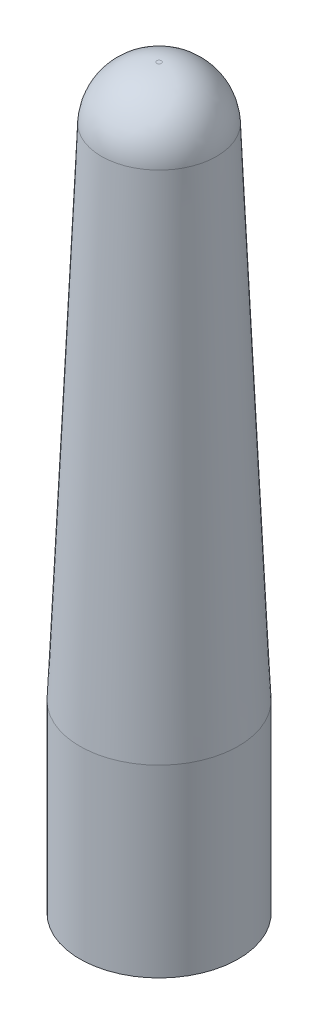
ISO-10303-21;
HEADER;
FILE_DESCRIPTION(('STEP AP214'),'2;1');
FILE_NAME('part.step','',(''),(''),'','','');
FILE_SCHEMA(('AUTOMOTIVE_DESIGN { 1 0 10303 214 1 1 1 1 }'));
ENDSEC;
DATA;
#1=APPLICATION_CONTEXT('core data for automotive mechanical design processes');
#2=APPLICATION_PROTOCOL_DEFINITION('international standard','automotive_design',2000,#1);
#3=PRODUCT_CONTEXT('',#1,'mechanical');
#4=PRODUCT('Part','Part','',(#3));
#5=PRODUCT_RELATED_PRODUCT_CATEGORY('part','',(#4));
#6=PRODUCT_DEFINITION_FORMATION('','',#4);
#7=PRODUCT_DEFINITION_CONTEXT('part definition',#1,'design');
#8=PRODUCT_DEFINITION('design','',#6,#7);
#9=PRODUCT_DEFINITION_SHAPE('','',#8);
#10=(LENGTH_UNIT() NAMED_UNIT(*) SI_UNIT(.MILLI.,.METRE.));
#11=(NAMED_UNIT(*) PLANE_ANGLE_UNIT() SI_UNIT($,.RADIAN.));
#12=(NAMED_UNIT(*) SI_UNIT($,.STERADIAN.) SOLID_ANGLE_UNIT());
#13=UNCERTAINTY_MEASURE_WITH_UNIT(LENGTH_MEASURE(1.E-05),#10,'distance_accuracy_value','');
#14=(GEOMETRIC_REPRESENTATION_CONTEXT(3) GLOBAL_UNCERTAINTY_ASSIGNED_CONTEXT((#13)) GLOBAL_UNIT_ASSIGNED_CONTEXT((#10,
#11,#12)) REPRESENTATION_CONTEXT('',''));
#15=CARTESIAN_POINT('',(0.,0.,0.));
#16=DIRECTION('',(0.,0.,1.));
#17=DIRECTION('',(1.,0.,0.));
#18=AXIS2_PLACEMENT_3D('',#15,#16,#17);
#19=CARTESIAN_POINT('',(0.,38.1,0.));
#20=DIRECTION('',(0.,1.,0.));
#21=DIRECTION('',(0.,0.,1.));
#22=AXIS2_PLACEMENT_3D('',#19,#20,#21);
#23=PLANE('',#22);
#24=CARTESIAN_POINT('',(0.,38.1,0.));
#25=DIRECTION('',(0.,1.,0.));
#26=DIRECTION('',(0.,0.,1.));
#27=AXIS2_PLACEMENT_3D('',#24,#25,#26);
#28=CIRCLE('',#27,0.161524511039541);
#29=CARTESIAN_POINT('',(0.,38.1,0.161524511039541));
#30=VERTEX_POINT('',#29);
#31=EDGE_CURVE('E10',#30,#30,#28,.T.);
#32=ORIENTED_EDGE('',*,*,#31,.T.);
#33=EDGE_LOOP('',(#32));
#34=FACE_BOUND('',#33,.T.);
#35=ADVANCED_FACE('F35',(#34),#23,.T.);
#36=CARTESIAN_POINT('',(0.,0.,0.));
#37=DIRECTION('',(0.,-1.,0.));
#38=DIRECTION('',(0.,0.,-1.));
#39=AXIS2_PLACEMENT_3D('',#36,#37,#38);
#40=CONICAL_SURFACE('',#39,5.461,0.0433062403947096);
#41=CARTESIAN_POINT('',(0.,34.4549452074099,0.));
#42=DIRECTION('',(0.,1.,0.));
#43=DIRECTION('',(0.,0.,1.));
#44=AXIS2_PLACEMENT_3D('',#41,#42,#43);
#45=CIRCLE('',#44,3.96795237434557);
#46=CARTESIAN_POINT('',(0.,34.4549452074099,3.96795237434557));
#47=VERTEX_POINT('',#46);
#48=EDGE_CURVE('E42',#47,#47,#45,.F.);
#49=ORIENTED_EDGE('',*,*,#48,.T.);
#50=EDGE_LOOP('',(#49));
#51=FACE_BOUND('',#50,.T.);
#52=CARTESIAN_POINT('',(0.,0.,0.));
#53=DIRECTION('',(0.,-1.,0.));
#54=DIRECTION('',(0.,0.,-1.));
#55=AXIS2_PLACEMENT_3D('',#52,#53,#54);
#56=CIRCLE('',#55,5.461);
#57=CARTESIAN_POINT('',(0.,0.,-5.461));
#58=VERTEX_POINT('',#57);
#59=EDGE_CURVE('E46',#58,#58,#56,.T.);
#60=ORIENTED_EDGE('',*,*,#59,.F.);
#61=EDGE_LOOP('',(#60));
#62=FACE_BOUND('',#61,.T.);
#63=ADVANCED_FACE('F61',(#51,#62),#40,.T.);
#64=CARTESIAN_POINT('',(0.,-12.7,0.));
#65=DIRECTION('',(0.,1.,0.));
#66=DIRECTION('',(0.,0.,1.));
#67=AXIS2_PLACEMENT_3D('',#64,#65,#66);
#68=CYLINDRICAL_SURFACE('',#67,5.461);
#69=CARTESIAN_POINT('',(0.,-12.7,0.));
#70=DIRECTION('',(0.,-1.,0.));
#71=DIRECTION('',(0.,0.,-1.));
#72=AXIS2_PLACEMENT_3D('',#69,#70,#71);
#73=CIRCLE('',#72,5.461);
#74=CARTESIAN_POINT('',(0.,-12.7,-5.461));
#75=VERTEX_POINT('',#74);
#76=EDGE_CURVE('E50',#75,#75,#73,.T.);
#77=ORIENTED_EDGE('',*,*,#76,.F.);
#78=EDGE_LOOP('',(#77));
#79=FACE_BOUND('',#78,.T.);
#80=ORIENTED_EDGE('',*,*,#59,.T.);
#81=EDGE_LOOP('',(#80));
#82=FACE_BOUND('',#81,.T.);
#83=ADVANCED_FACE('F58',(#79,#82),#68,.T.);
#84=CARTESIAN_POINT('',(0.,-12.7,0.));
#85=DIRECTION('',(0.,-1.,0.));
#86=DIRECTION('',(0.,0.,-1.));
#87=AXIS2_PLACEMENT_3D('',#84,#85,#86);
#88=PLANE('',#87);
#89=ORIENTED_EDGE('',*,*,#76,.T.);
#90=EDGE_LOOP('',(#89));
#91=FACE_BOUND('',#90,.T.);
#92=ADVANCED_FACE('F56',(#91),#88,.T.);
#93=CARTESIAN_POINT('',(0.,34.29,0.));
#94=DIRECTION('',(0.,1.,0.));
#95=DIRECTION('',(0.,0.,1.));
#96=AXIS2_PLACEMENT_3D('',#93,#94,#95);
#97=DEGENERATE_TOROIDAL_SURFACE('',#96,0.161524511039541,3.81,.T.);
#98=ORIENTED_EDGE('',*,*,#31,.F.);
#99=EDGE_LOOP('',(#98));
#100=FACE_BOUND('',#99,.T.);
#101=ORIENTED_EDGE('',*,*,#48,.F.);
#102=EDGE_LOOP('',(#101));
#103=FACE_BOUND('',#102,.T.);
#104=ADVANCED_FACE('F37',(#100,#103),#97,.T.);
#105=CLOSED_SHELL('',(#35,#63,#83,#92,#104));
#106=MANIFOLD_SOLID_BREP('B2',#105);
#107=ADVANCED_BREP_SHAPE_REPRESENTATION('',(#18,#106),#14);
#108=SHAPE_DEFINITION_REPRESENTATION(#9,#107);
ENDSEC;
END-ISO-10303-21;
